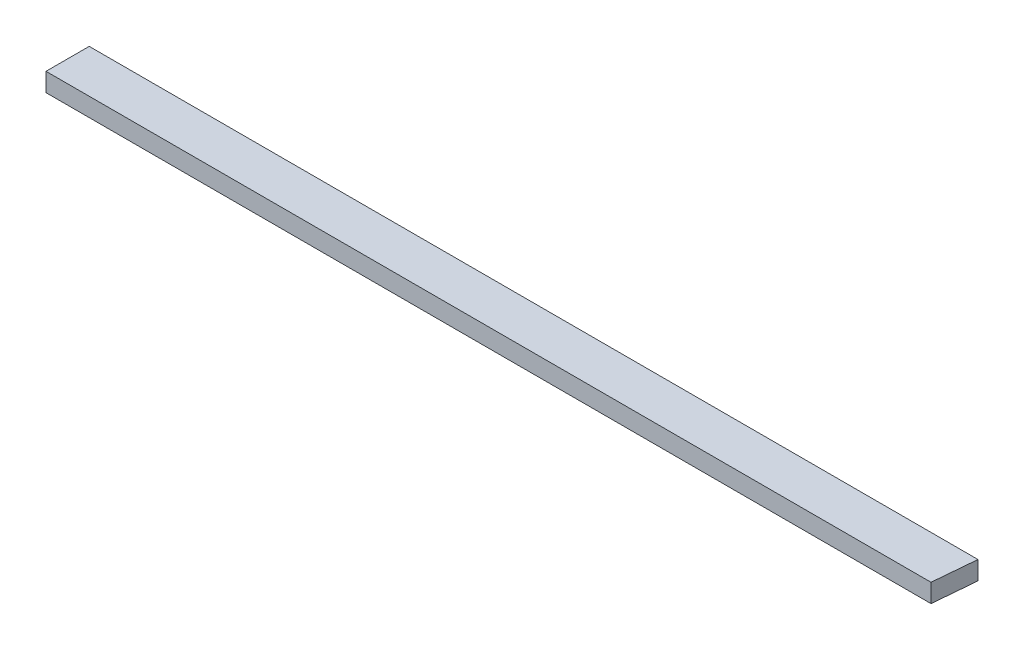
ISO-10303-21;
HEADER;
FILE_DESCRIPTION(('STEP AP214'),'2;1');
FILE_NAME('part.step','',(''),(''),'','','');
FILE_SCHEMA(('AUTOMOTIVE_DESIGN { 1 0 10303 214 1 1 1 1 }'));
ENDSEC;
DATA;
#1=APPLICATION_CONTEXT('core data for automotive mechanical design processes');
#2=APPLICATION_PROTOCOL_DEFINITION('international standard','automotive_design',2000,#1);
#3=PRODUCT_CONTEXT('',#1,'mechanical');
#4=PRODUCT('Part','Part','',(#3));
#5=PRODUCT_RELATED_PRODUCT_CATEGORY('part','',(#4));
#6=PRODUCT_DEFINITION_FORMATION('','',#4);
#7=PRODUCT_DEFINITION_CONTEXT('part definition',#1,'design');
#8=PRODUCT_DEFINITION('design','',#6,#7);
#9=PRODUCT_DEFINITION_SHAPE('','',#8);
#10=(LENGTH_UNIT() NAMED_UNIT(*) SI_UNIT(.MILLI.,.METRE.));
#11=(NAMED_UNIT(*) PLANE_ANGLE_UNIT() SI_UNIT($,.RADIAN.));
#12=(NAMED_UNIT(*) SI_UNIT($,.STERADIAN.) SOLID_ANGLE_UNIT());
#13=UNCERTAINTY_MEASURE_WITH_UNIT(LENGTH_MEASURE(1.E-05),#10,'distance_accuracy_value','');
#14=(GEOMETRIC_REPRESENTATION_CONTEXT(3) GLOBAL_UNCERTAINTY_ASSIGNED_CONTEXT((#13)) GLOBAL_UNIT_ASSIGNED_CONTEXT((#10,
#11,#12)) REPRESENTATION_CONTEXT('',''));
#15=CARTESIAN_POINT('',(0.,0.,0.));
#16=DIRECTION('',(0.,0.,1.));
#17=DIRECTION('',(1.,0.,0.));
#18=AXIS2_PLACEMENT_3D('',#15,#16,#17);
#19=CARTESIAN_POINT('',(0.,-38.1,0.));
#20=DIRECTION('',(-1.,0.,0.));
#21=DIRECTION('',(0.,0.,1.));
#22=AXIS2_PLACEMENT_3D('',#19,#20,#21);
#23=PLANE('',#22);
#24=DIRECTION('',(0.,0.,1.));
#25=VECTOR('',#24,1.);
#26=CARTESIAN_POINT('',(0.,0.,0.));
#27=LINE('',#26,#25);
#28=CARTESIAN_POINT('',(0.,0.,-88.9));
#29=VERTEX_POINT('',#28);
#30=CARTESIAN_POINT('',(0.,0.,0.));
#31=VERTEX_POINT('',#30);
#32=EDGE_CURVE('E101',#29,#31,#27,.T.);
#33=ORIENTED_EDGE('',*,*,#32,.F.);
#34=DIRECTION('',(0.,1.,0.));
#35=VECTOR('',#34,1.);
#36=CARTESIAN_POINT('',(0.,-38.1,-88.9));
#37=LINE('',#36,#35);
#38=CARTESIAN_POINT('',(0.,-38.1,-88.9));
#39=VERTEX_POINT('',#38);
#40=EDGE_CURVE('E11',#39,#29,#37,.T.);
#41=ORIENTED_EDGE('',*,*,#40,.F.);
#42=DIRECTION('',(0.,0.,1.));
#43=VECTOR('',#42,1.);
#44=CARTESIAN_POINT('',(0.,-38.1,0.));
#45=LINE('',#44,#43);
#46=CARTESIAN_POINT('',(0.,-38.1,0.));
#47=VERTEX_POINT('',#46);
#48=EDGE_CURVE('E95',#39,#47,#45,.T.);
#49=ORIENTED_EDGE('',*,*,#48,.T.);
#50=DIRECTION('',(0.,1.,0.));
#51=VECTOR('',#50,1.);
#52=CARTESIAN_POINT('',(0.,-38.1,0.));
#53=LINE('',#52,#51);
#54=EDGE_CURVE('E40',#47,#31,#53,.T.);
#55=ORIENTED_EDGE('',*,*,#54,.T.);
#56=EDGE_LOOP('',(#33,#41,#49,#55));
#57=FACE_BOUND('',#56,.T.);
#58=ADVANCED_FACE('F37',(#57),#23,.T.);
#59=CARTESIAN_POINT('',(0.,-38.1,-88.9));
#60=DIRECTION('',(0.,0.,-1.));
#61=DIRECTION('',(-1.,0.,0.));
#62=AXIS2_PLACEMENT_3D('',#59,#60,#61);
#63=PLANE('',#62);
#64=DIRECTION('',(-1.,0.,0.));
#65=VECTOR('',#64,1.);
#66=CARTESIAN_POINT('',(0.,0.,-88.9));
#67=LINE('',#66,#65);
#68=CARTESIAN_POINT('',(1828.8,0.,-88.9));
#69=VERTEX_POINT('',#68);
#70=EDGE_CURVE('E97',#69,#29,#67,.T.);
#71=ORIENTED_EDGE('',*,*,#70,.F.);
#72=DIRECTION('',(0.,1.,0.));
#73=VECTOR('',#72,1.);
#74=CARTESIAN_POINT('',(1828.8,-38.1,-88.9));
#75=LINE('',#74,#73);
#76=CARTESIAN_POINT('',(1828.8,-38.1,-88.9));
#77=VERTEX_POINT('',#76);
#78=EDGE_CURVE('E46',#77,#69,#75,.T.);
#79=ORIENTED_EDGE('',*,*,#78,.F.);
#80=DIRECTION('',(-1.,0.,0.));
#81=VECTOR('',#80,1.);
#82=CARTESIAN_POINT('',(0.,-38.1,-88.9));
#83=LINE('',#82,#81);
#84=EDGE_CURVE('E92',#77,#39,#83,.T.);
#85=ORIENTED_EDGE('',*,*,#84,.T.);
#86=ORIENTED_EDGE('',*,*,#40,.T.);
#87=EDGE_LOOP('',(#71,#79,#85,#86));
#88=FACE_BOUND('',#87,.T.);
#89=ADVANCED_FACE('F111',(#88),#63,.T.);
#90=CARTESIAN_POINT('',(1828.8,-38.1,-88.9));
#91=DIRECTION('',(0.996194698091745,0.,0.0871557427476618));
#92=DIRECTION('',(0.0871557427476618,0.,-0.996194698091745));
#93=AXIS2_PLACEMENT_3D('',#90,#91,#92);
#94=PLANE('',#93);
#95=DIRECTION('',(0.0871557427476618,0.,-0.996194698091745));
#96=VECTOR('',#95,1.);
#97=CARTESIAN_POINT('',(1828.8,0.,-88.9));
#98=LINE('',#97,#96);
#99=CARTESIAN_POINT('',(1821.02225781254,0.,0.));
#100=VERTEX_POINT('',#99);
#101=EDGE_CURVE('E87',#100,#69,#98,.T.);
#102=ORIENTED_EDGE('',*,*,#101,.F.);
#103=DIRECTION('',(0.,1.,0.));
#104=VECTOR('',#103,1.);
#105=CARTESIAN_POINT('',(1821.02225781254,-38.1,0.));
#106=LINE('',#105,#104);
#107=CARTESIAN_POINT('',(1821.02225781254,-38.1,0.));
#108=VERTEX_POINT('',#107);
#109=EDGE_CURVE('E82',#108,#100,#106,.T.);
#110=ORIENTED_EDGE('',*,*,#109,.F.);
#111=DIRECTION('',(0.0871557427476618,0.,-0.996194698091745));
#112=VECTOR('',#111,1.);
#113=CARTESIAN_POINT('',(1828.8,-38.1,-88.9));
#114=LINE('',#113,#112);
#115=EDGE_CURVE('E85',#108,#77,#114,.T.);
#116=ORIENTED_EDGE('',*,*,#115,.T.);
#117=ORIENTED_EDGE('',*,*,#78,.T.);
#118=EDGE_LOOP('',(#102,#110,#116,#117));
#119=FACE_BOUND('',#118,.T.);
#120=ADVANCED_FACE('F84',(#119),#94,.T.);
#121=CARTESIAN_POINT('',(0.,-38.1,0.));
#122=DIRECTION('',(0.,0.,1.));
#123=DIRECTION('',(1.,0.,0.));
#124=AXIS2_PLACEMENT_3D('',#121,#122,#123);
#125=PLANE('',#124);
#126=DIRECTION('',(1.,0.,0.));
#127=VECTOR('',#126,1.);
#128=CARTESIAN_POINT('',(0.,0.,0.));
#129=LINE('',#128,#127);
#130=EDGE_CURVE('E104',#31,#100,#129,.T.);
#131=ORIENTED_EDGE('',*,*,#130,.F.);
#132=ORIENTED_EDGE('',*,*,#54,.F.);
#133=DIRECTION('',(1.,0.,0.));
#134=VECTOR('',#133,1.);
#135=CARTESIAN_POINT('',(0.,-38.1,0.));
#136=LINE('',#135,#134);
#137=EDGE_CURVE('E91',#47,#108,#136,.T.);
#138=ORIENTED_EDGE('',*,*,#137,.T.);
#139=ORIENTED_EDGE('',*,*,#109,.T.);
#140=EDGE_LOOP('',(#131,#132,#138,#139));
#141=FACE_BOUND('',#140,.T.);
#142=ADVANCED_FACE('F94',(#141),#125,.T.);
#143=CARTESIAN_POINT('',(0.,-38.1,0.));
#144=DIRECTION('',(0.,-1.,0.));
#145=DIRECTION('',(0.,0.,-1.));
#146=AXIS2_PLACEMENT_3D('',#143,#144,#145);
#147=PLANE('',#146);
#148=ORIENTED_EDGE('',*,*,#48,.F.);
#149=ORIENTED_EDGE('',*,*,#84,.F.);
#150=ORIENTED_EDGE('',*,*,#115,.F.);
#151=ORIENTED_EDGE('',*,*,#137,.F.);
#152=EDGE_LOOP('',(#148,#149,#150,#151));
#153=FACE_BOUND('',#152,.T.);
#154=ADVANCED_FACE('F90',(#153),#147,.T.);
#155=CARTESIAN_POINT('',(0.,0.,0.));
#156=DIRECTION('',(0.,-1.,0.));
#157=DIRECTION('',(0.,0.,-1.));
#158=AXIS2_PLACEMENT_3D('',#155,#156,#157);
#159=PLANE('',#158);
#160=ORIENTED_EDGE('',*,*,#32,.T.);
#161=ORIENTED_EDGE('',*,*,#130,.T.);
#162=ORIENTED_EDGE('',*,*,#101,.T.);
#163=ORIENTED_EDGE('',*,*,#70,.T.);
#164=EDGE_LOOP('',(#160,#161,#162,#163));
#165=FACE_BOUND('',#164,.T.);
#166=ADVANCED_FACE('F110',(#165),#159,.F.);
#167=CLOSED_SHELL('',(#58,#89,#120,#142,#154,#166));
#168=MANIFOLD_SOLID_BREP('B2',#167);
#169=ADVANCED_BREP_SHAPE_REPRESENTATION('',(#18,#168),#14);
#170=SHAPE_DEFINITION_REPRESENTATION(#9,#169);
ENDSEC;
END-ISO-10303-21;
